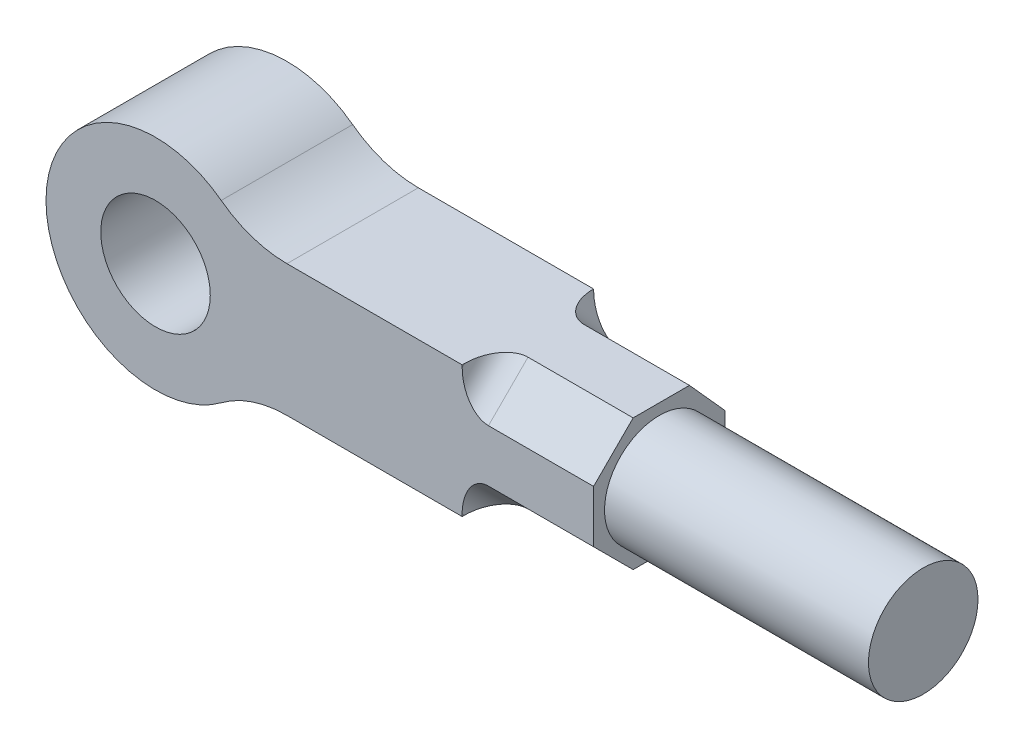
ISO-10303-21;
HEADER;
FILE_DESCRIPTION(('STEP AP214'),'2;1');
FILE_NAME('part.step','',(''),(''),'','','');
FILE_SCHEMA(('AUTOMOTIVE_DESIGN { 1 0 10303 214 1 1 1 1 }'));
ENDSEC;
DATA;
#1=APPLICATION_CONTEXT('core data for automotive mechanical design processes');
#2=APPLICATION_PROTOCOL_DEFINITION('international standard','automotive_design',2000,#1);
#3=PRODUCT_CONTEXT('',#1,'mechanical');
#4=PRODUCT('Part','Part','',(#3));
#5=PRODUCT_RELATED_PRODUCT_CATEGORY('part','',(#4));
#6=PRODUCT_DEFINITION_FORMATION('','',#4);
#7=PRODUCT_DEFINITION_CONTEXT('part definition',#1,'design');
#8=PRODUCT_DEFINITION('design','',#6,#7);
#9=PRODUCT_DEFINITION_SHAPE('','',#8);
#10=(LENGTH_UNIT() NAMED_UNIT(*) SI_UNIT(.MILLI.,.METRE.));
#11=(NAMED_UNIT(*) PLANE_ANGLE_UNIT() SI_UNIT($,.RADIAN.));
#12=(NAMED_UNIT(*) SI_UNIT($,.STERADIAN.) SOLID_ANGLE_UNIT());
#13=UNCERTAINTY_MEASURE_WITH_UNIT(LENGTH_MEASURE(1.E-05),#10,'distance_accuracy_value','');
#14=(GEOMETRIC_REPRESENTATION_CONTEXT(3) GLOBAL_UNCERTAINTY_ASSIGNED_CONTEXT((#13)) GLOBAL_UNIT_ASSIGNED_CONTEXT((#10,
#11,#12)) REPRESENTATION_CONTEXT('',''));
#15=CARTESIAN_POINT('',(0.,0.,0.));
#16=DIRECTION('',(0.,0.,1.));
#17=DIRECTION('',(1.,0.,0.));
#18=AXIS2_PLACEMENT_3D('',#15,#16,#17);
#19=CARTESIAN_POINT('',(60.,-80.,60.));
#20=DIRECTION('',(0.,0.,1.));
#21=DIRECTION('',(1.,0.,0.));
#22=AXIS2_PLACEMENT_3D('',#19,#20,#21);
#23=PLANE('',#22);
#24=CARTESIAN_POINT('',(0.,0.,60.));
#25=DIRECTION('',(0.,0.,1.));
#26=DIRECTION('',(1.,0.,0.));
#27=AXIS2_PLACEMENT_3D('',#24,#25,#26);
#28=CIRCLE('',#27,25.);
#29=CARTESIAN_POINT('',(25.,0.,60.));
#30=VERTEX_POINT('',#29);
#31=EDGE_CURVE('E318',#30,#30,#28,.T.);
#32=ORIENTED_EDGE('',*,*,#31,.F.);
#33=EDGE_LOOP('',(#32));
#34=FACE_BOUND('',#33,.T.);
#35=DIRECTION('',(0.,-1.,0.));
#36=VECTOR('',#35,1.);
#37=CARTESIAN_POINT('',(140.,0.,60.));
#38=LINE('',#37,#36);
#39=CARTESIAN_POINT('',(140.,-28.9105627484771,60.));
#40=VERTEX_POINT('',#39);
#41=CARTESIAN_POINT('',(140.,-30.,60.));
#42=VERTEX_POINT('',#41);
#43=EDGE_CURVE('E266',#40,#42,#38,.T.);
#44=ORIENTED_EDGE('',*,*,#43,.F.);
#45=CARTESIAN_POINT('',(152.,-28.9105627484771,60.));
#46=DIRECTION('',(0.,0.,1.));
#47=DIRECTION('',(0.,1.,0.));
#48=AXIS2_PLACEMENT_3D('',#45,#46,#47);
#49=ELLIPSE('',#48,16.9705627484771,12.);
#50=CARTESIAN_POINT('',(152.,-11.94,60.));
#51=VERTEX_POINT('',#50);
#52=EDGE_CURVE('E256',#40,#51,#49,.F.);
#53=ORIENTED_EDGE('',*,*,#52,.T.);
#54=DIRECTION('',(1.,0.,0.));
#55=VECTOR('',#54,1.);
#56=CARTESIAN_POINT('',(140.,-11.94,60.));
#57=LINE('',#56,#55);
#58=CARTESIAN_POINT('',(200.,-11.94,60.));
#59=VERTEX_POINT('',#58);
#60=EDGE_CURVE('E263',#51,#59,#57,.T.);
#61=ORIENTED_EDGE('',*,*,#60,.T.);
#62=DIRECTION('',(0.,1.,0.));
#63=VECTOR('',#62,1.);
#64=CARTESIAN_POINT('',(200.,30.,60.));
#65=LINE('',#64,#63);
#66=CARTESIAN_POINT('',(200.,11.94,60.));
#67=VERTEX_POINT('',#66);
#68=EDGE_CURVE('E325',#59,#67,#65,.T.);
#69=ORIENTED_EDGE('',*,*,#68,.T.);
#70=DIRECTION('',(1.,0.,0.));
#71=VECTOR('',#70,1.);
#72=CARTESIAN_POINT('',(140.,11.94,60.));
#73=LINE('',#72,#71);
#74=CARTESIAN_POINT('',(152.,11.94,60.));
#75=VERTEX_POINT('',#74);
#76=EDGE_CURVE('E308',#75,#67,#73,.T.);
#77=ORIENTED_EDGE('',*,*,#76,.F.);
#78=CARTESIAN_POINT('',(152.,28.9105627484771,60.));
#79=DIRECTION('',(0.,0.,1.));
#80=DIRECTION('',(0.,1.,0.));
#81=AXIS2_PLACEMENT_3D('',#78,#79,#80);
#82=ELLIPSE('',#81,16.9705627484771,12.);
#83=CARTESIAN_POINT('',(140.,28.9105627484771,60.));
#84=VERTEX_POINT('',#83);
#85=EDGE_CURVE('E54',#75,#84,#82,.F.);
#86=ORIENTED_EDGE('',*,*,#85,.T.);
#87=DIRECTION('',(0.,-1.,0.));
#88=VECTOR('',#87,1.);
#89=CARTESIAN_POINT('',(140.,0.,60.));
#90=LINE('',#89,#88);
#91=CARTESIAN_POINT('',(140.,30.,60.));
#92=VERTEX_POINT('',#91);
#93=EDGE_CURVE('E302',#92,#84,#90,.T.);
#94=ORIENTED_EDGE('',*,*,#93,.F.);
#95=DIRECTION('',(-1.,0.,0.));
#96=VECTOR('',#95,1.);
#97=CARTESIAN_POINT('',(60.,30.,60.));
#98=LINE('',#97,#96);
#99=CARTESIAN_POINT('',(60.,30.,60.));
#100=VERTEX_POINT('',#99);
#101=EDGE_CURVE('E328',#92,#100,#98,.T.);
#102=ORIENTED_EDGE('',*,*,#101,.T.);
#103=CARTESIAN_POINT('',(60.,80.,60.));
#104=DIRECTION('',(0.,0.,-1.));
#105=DIRECTION('',(-1.,0.,0.));
#106=AXIS2_PLACEMENT_3D('',#103,#104,#105);
#107=CIRCLE('',#106,50.);
#108=CARTESIAN_POINT('',(30.,40.,60.));
#109=VERTEX_POINT('',#108);
#110=EDGE_CURVE('E332',#100,#109,#107,.T.);
#111=ORIENTED_EDGE('',*,*,#110,.T.);
#112=CARTESIAN_POINT('',(0.,0.,60.));
#113=DIRECTION('',(0.,0.,1.));
#114=DIRECTION('',(1.,0.,0.));
#115=AXIS2_PLACEMENT_3D('',#112,#113,#114);
#116=CIRCLE('',#115,50.);
#117=CARTESIAN_POINT('',(30.,-40.,60.));
#118=VERTEX_POINT('',#117);
#119=EDGE_CURVE('E335',#109,#118,#116,.T.);
#120=ORIENTED_EDGE('',*,*,#119,.T.);
#121=CARTESIAN_POINT('',(60.,-80.,60.));
#122=DIRECTION('',(0.,0.,-1.));
#123=DIRECTION('',(1.,0.,0.));
#124=AXIS2_PLACEMENT_3D('',#121,#122,#123);
#125=CIRCLE('',#124,50.);
#126=CARTESIAN_POINT('',(60.,-30.,60.));
#127=VERTEX_POINT('',#126);
#128=EDGE_CURVE('E338',#118,#127,#125,.T.);
#129=ORIENTED_EDGE('',*,*,#128,.T.);
#130=DIRECTION('',(1.,0.,0.));
#131=VECTOR('',#130,1.);
#132=CARTESIAN_POINT('',(200.,-30.,60.));
#133=LINE('',#132,#131);
#134=EDGE_CURVE('E341',#127,#42,#133,.T.);
#135=ORIENTED_EDGE('',*,*,#134,.T.);
#136=EDGE_LOOP('',(#44,#53,#61,#69,#77,#86,#94,#102,#111,#120,#129,#135));
#137=FACE_BOUND('',#136,.T.);
#138=ADVANCED_FACE('F45',(#34,#137),#23,.T.);
#139=CARTESIAN_POINT('',(200.,30.,60.));
#140=DIRECTION('',(-1.,0.,0.));
#141=DIRECTION('',(0.,0.,1.));
#142=AXIS2_PLACEMENT_3D('',#139,#140,#141);
#143=PLANE('',#142);
#144=CARTESIAN_POINT('',(200.,0.,30.));
#145=DIRECTION('',(1.,0.,0.));
#146=DIRECTION('',(0.,0.,-1.));
#147=AXIS2_PLACEMENT_3D('',#144,#145,#146);
#148=CIRCLE('',#147,25.);
#149=CARTESIAN_POINT('',(200.,0.,4.99999999999999));
#150=VERTEX_POINT('',#149);
#151=EDGE_CURVE('E203',#150,#150,#148,.T.);
#152=ORIENTED_EDGE('',*,*,#151,.F.);
#153=EDGE_LOOP('',(#152));
#154=FACE_BOUND('',#153,.T.);
#155=DIRECTION('',(0.,-0.707106781186548,-0.707106781186547));
#156=VECTOR('',#155,1.);
#157=CARTESIAN_POINT('',(200.,-35.97,35.97));
#158=LINE('',#157,#156);
#159=CARTESIAN_POINT('',(200.,-30.,41.94));
#160=VERTEX_POINT('',#159);
#161=EDGE_CURVE('E273',#59,#160,#158,.T.);
#162=ORIENTED_EDGE('',*,*,#161,.T.);
#163=DIRECTION('',(0.,0.,-1.));
#164=VECTOR('',#163,1.);
#165=CARTESIAN_POINT('',(200.,-30.,60.));
#166=LINE('',#165,#164);
#167=CARTESIAN_POINT('',(200.,-30.,18.06));
#168=VERTEX_POINT('',#167);
#169=EDGE_CURVE('E344',#160,#168,#166,.T.);
#170=ORIENTED_EDGE('',*,*,#169,.T.);
#171=DIRECTION('',(0.,-0.707106781186548,0.707106781186547));
#172=VECTOR('',#171,1.);
#173=CARTESIAN_POINT('',(200.,-5.96999999999999,-5.97));
#174=LINE('',#173,#172);
#175=CARTESIAN_POINT('',(200.,-11.94,0.));
#176=VERTEX_POINT('',#175);
#177=EDGE_CURVE('E297',#176,#168,#174,.T.);
#178=ORIENTED_EDGE('',*,*,#177,.F.);
#179=DIRECTION('',(0.,1.,0.));
#180=VECTOR('',#179,1.);
#181=CARTESIAN_POINT('',(200.,30.,0.));
#182=LINE('',#181,#180);
#183=CARTESIAN_POINT('',(200.,11.94,0.));
#184=VERTEX_POINT('',#183);
#185=EDGE_CURVE('E193',#176,#184,#182,.T.);
#186=ORIENTED_EDGE('',*,*,#185,.T.);
#187=DIRECTION('',(0.,-0.743792235721476,-0.668410884172639));
#188=VECTOR('',#187,1.);
#189=CARTESIAN_POINT('',(200.,5.33447093436056,-5.93607638147687));
#190=LINE('',#189,#188);
#191=CARTESIAN_POINT('',(200.,30.,16.2296673565684));
#192=VERTEX_POINT('',#191);
#193=EDGE_CURVE('E174',#192,#184,#190,.T.);
#194=ORIENTED_EDGE('',*,*,#193,.F.);
#195=DIRECTION('',(0.,0.,-1.));
#196=VECTOR('',#195,1.);
#197=CARTESIAN_POINT('',(200.,30.,60.));
#198=LINE('',#197,#196);
#199=CARTESIAN_POINT('',(200.,30.,41.94));
#200=VERTEX_POINT('',#199);
#201=EDGE_CURVE('E190',#200,#192,#198,.T.);
#202=ORIENTED_EDGE('',*,*,#201,.F.);
#203=DIRECTION('',(0.,-0.707106781186548,0.707106781186548));
#204=VECTOR('',#203,1.);
#205=CARTESIAN_POINT('',(200.,35.97,35.97));
#206=LINE('',#205,#204);
#207=EDGE_CURVE('E303',#200,#67,#206,.T.);
#208=ORIENTED_EDGE('',*,*,#207,.T.);
#209=ORIENTED_EDGE('',*,*,#68,.F.);
#210=EDGE_LOOP('',(#162,#170,#178,#186,#194,#202,#208,#209));
#211=FACE_BOUND('',#210,.T.);
#212=ADVANCED_FACE('F188',(#154,#211),#143,.F.);
#213=CARTESIAN_POINT('',(60.,30.,60.));
#214=DIRECTION('',(0.,-1.,0.));
#215=DIRECTION('',(0.,0.,-1.));
#216=AXIS2_PLACEMENT_3D('',#213,#214,#215);
#217=PLANE('',#216);
#218=ORIENTED_EDGE('',*,*,#201,.T.);
#219=DIRECTION('',(1.,0.,0.));
#220=VECTOR('',#219,1.);
#221=CARTESIAN_POINT('',(140.,30.,16.2296673565684));
#222=LINE('',#221,#220);
#223=CARTESIAN_POINT('',(152.,30.,16.2296673565684));
#224=VERTEX_POINT('',#223);
#225=EDGE_CURVE('E170',#224,#192,#222,.T.);
#226=ORIENTED_EDGE('',*,*,#225,.F.);
#227=CARTESIAN_POINT('',(152.,30.,0.0961297587201877));
#228=DIRECTION('',(0.,-1.,0.));
#229=DIRECTION('',(0.,0.,-1.));
#230=AXIS2_PLACEMENT_3D('',#227,#228,#229);
#231=ELLIPSE('',#230,16.1335375978482,12.);
#232=CARTESIAN_POINT('',(140.,30.,0.0961297587201878));
#233=VERTEX_POINT('',#232);
#234=EDGE_CURVE('E250',#224,#233,#231,.T.);
#235=ORIENTED_EDGE('',*,*,#234,.T.);
#236=DIRECTION('',(0.,0.,1.));
#237=VECTOR('',#236,1.);
#238=CARTESIAN_POINT('',(140.,30.,0.));
#239=LINE('',#238,#237);
#240=CARTESIAN_POINT('',(140.,30.,0.));
#241=VERTEX_POINT('',#240);
#242=EDGE_CURVE('E195',#241,#233,#239,.T.);
#243=ORIENTED_EDGE('',*,*,#242,.F.);
#244=DIRECTION('',(-1.,0.,0.));
#245=VECTOR('',#244,1.);
#246=CARTESIAN_POINT('',(60.,30.,0.));
#247=LINE('',#246,#245);
#248=CARTESIAN_POINT('',(60.,30.,0.));
#249=VERTEX_POINT('',#248);
#250=EDGE_CURVE('E347',#241,#249,#247,.T.);
#251=ORIENTED_EDGE('',*,*,#250,.T.);
#252=DIRECTION('',(0.,0.,-1.));
#253=VECTOR('',#252,1.);
#254=CARTESIAN_POINT('',(60.,30.,60.));
#255=LINE('',#254,#253);
#256=EDGE_CURVE('E204',#100,#249,#255,.T.);
#257=ORIENTED_EDGE('',*,*,#256,.F.);
#258=ORIENTED_EDGE('',*,*,#101,.F.);
#259=DIRECTION('',(0.,0.,1.));
#260=VECTOR('',#259,1.);
#261=CARTESIAN_POINT('',(140.,30.,0.));
#262=LINE('',#261,#260);
#263=CARTESIAN_POINT('',(140.,30.,58.9105627484771));
#264=VERTEX_POINT('',#263);
#265=EDGE_CURVE('E299',#264,#92,#262,.T.);
#266=ORIENTED_EDGE('',*,*,#265,.F.);
#267=CARTESIAN_POINT('',(152.,30.,58.9105627484771));
#268=DIRECTION('',(0.,-1.,0.));
#269=DIRECTION('',(0.,0.,-1.));
#270=AXIS2_PLACEMENT_3D('',#267,#268,#269);
#271=ELLIPSE('',#270,16.9705627484771,12.);
#272=CARTESIAN_POINT('',(152.,30.,41.94));
#273=VERTEX_POINT('',#272);
#274=EDGE_CURVE('E11',#264,#273,#271,.T.);
#275=ORIENTED_EDGE('',*,*,#274,.T.);
#276=DIRECTION('',(1.,0.,0.));
#277=VECTOR('',#276,1.);
#278=CARTESIAN_POINT('',(140.,30.,41.94));
#279=LINE('',#278,#277);
#280=EDGE_CURVE('E200',#273,#200,#279,.T.);
#281=ORIENTED_EDGE('',*,*,#280,.T.);
#282=EDGE_LOOP('',(#218,#226,#235,#243,#251,#257,#258,#266,#275,#281));
#283=FACE_BOUND('',#282,.T.);
#284=ADVANCED_FACE('F198',(#283),#217,.F.);
#285=CARTESIAN_POINT('',(200.,-30.,60.));
#286=DIRECTION('',(0.,1.,0.));
#287=DIRECTION('',(-1.,0.,0.));
#288=AXIS2_PLACEMENT_3D('',#285,#286,#287);
#289=PLANE('',#288);
#290=DIRECTION('',(1.,0.,0.));
#291=VECTOR('',#290,1.);
#292=CARTESIAN_POINT('',(140.,-30.,41.94));
#293=LINE('',#292,#291);
#294=CARTESIAN_POINT('',(152.,-30.,41.94));
#295=VERTEX_POINT('',#294);
#296=EDGE_CURVE('E276',#295,#160,#293,.T.);
#297=ORIENTED_EDGE('',*,*,#296,.F.);
#298=CARTESIAN_POINT('',(152.,-30.,58.9105627484771));
#299=DIRECTION('',(0.,1.,0.));
#300=DIRECTION('',(0.,0.,1.));
#301=AXIS2_PLACEMENT_3D('',#298,#299,#300);
#302=ELLIPSE('',#301,16.9705627484771,12.);
#303=CARTESIAN_POINT('',(140.,-30.,58.9105627484771));
#304=VERTEX_POINT('',#303);
#305=EDGE_CURVE('E253',#295,#304,#302,.T.);
#306=ORIENTED_EDGE('',*,*,#305,.T.);
#307=DIRECTION('',(0.,0.,-1.));
#308=VECTOR('',#307,1.);
#309=CARTESIAN_POINT('',(140.,-30.,0.));
#310=LINE('',#309,#308);
#311=EDGE_CURVE('E277',#42,#304,#310,.T.);
#312=ORIENTED_EDGE('',*,*,#311,.F.);
#313=ORIENTED_EDGE('',*,*,#134,.F.);
#314=DIRECTION('',(0.,0.,-1.));
#315=VECTOR('',#314,1.);
#316=CARTESIAN_POINT('',(60.,-30.,60.));
#317=LINE('',#316,#315);
#318=CARTESIAN_POINT('',(60.,-30.,0.));
#319=VERTEX_POINT('',#318);
#320=EDGE_CURVE('E365',#127,#319,#317,.T.);
#321=ORIENTED_EDGE('',*,*,#320,.T.);
#322=DIRECTION('',(1.,0.,0.));
#323=VECTOR('',#322,1.);
#324=CARTESIAN_POINT('',(200.,-30.,0.));
#325=LINE('',#324,#323);
#326=CARTESIAN_POINT('',(140.,-30.,0.));
#327=VERTEX_POINT('',#326);
#328=EDGE_CURVE('E329',#319,#327,#325,.T.);
#329=ORIENTED_EDGE('',*,*,#328,.T.);
#330=DIRECTION('',(0.,0.,-1.));
#331=VECTOR('',#330,1.);
#332=CARTESIAN_POINT('',(140.,-30.,0.));
#333=LINE('',#332,#331);
#334=CARTESIAN_POINT('',(140.,-30.,1.08943725152286));
#335=VERTEX_POINT('',#334);
#336=EDGE_CURVE('E413',#335,#327,#333,.T.);
#337=ORIENTED_EDGE('',*,*,#336,.F.);
#338=CARTESIAN_POINT('',(152.,-30.,1.08943725152286));
#339=DIRECTION('',(0.,1.,0.));
#340=DIRECTION('',(0.,0.,1.));
#341=AXIS2_PLACEMENT_3D('',#338,#339,#340);
#342=ELLIPSE('',#341,16.9705627484771,12.);
#343=CARTESIAN_POINT('',(152.,-30.,18.06));
#344=VERTEX_POINT('',#343);
#345=EDGE_CURVE('E241',#335,#344,#342,.T.);
#346=ORIENTED_EDGE('',*,*,#345,.T.);
#347=DIRECTION('',(1.,0.,0.));
#348=VECTOR('',#347,1.);
#349=CARTESIAN_POINT('',(140.,-30.,18.06));
#350=LINE('',#349,#348);
#351=EDGE_CURVE('E196',#344,#168,#350,.T.);
#352=ORIENTED_EDGE('',*,*,#351,.T.);
#353=ORIENTED_EDGE('',*,*,#169,.F.);
#354=EDGE_LOOP('',(#297,#306,#312,#313,#321,#329,#337,#346,#352,#353));
#355=FACE_BOUND('',#354,.T.);
#356=ADVANCED_FACE('F283',(#355),#289,.F.);
#357=CARTESIAN_POINT('',(60.,-80.,0.));
#358=DIRECTION('',(0.,0.,1.));
#359=DIRECTION('',(1.,0.,0.));
#360=AXIS2_PLACEMENT_3D('',#357,#358,#359);
#361=PLANE('',#360);
#362=ORIENTED_EDGE('',*,*,#185,.F.);
#363=DIRECTION('',(1.,0.,0.));
#364=VECTOR('',#363,1.);
#365=CARTESIAN_POINT('',(140.,-11.94,0.));
#366=LINE('',#365,#364);
#367=CARTESIAN_POINT('',(152.,-11.94,0.));
#368=VERTEX_POINT('',#367);
#369=EDGE_CURVE('E416',#368,#176,#366,.T.);
#370=ORIENTED_EDGE('',*,*,#369,.F.);
#371=CARTESIAN_POINT('',(152.,-28.9105627484771,0.));
#372=DIRECTION('',(0.,0.,1.));
#373=DIRECTION('',(0.,-1.,0.));
#374=AXIS2_PLACEMENT_3D('',#371,#372,#373);
#375=ELLIPSE('',#374,16.9705627484771,12.);
#376=CARTESIAN_POINT('',(140.,-28.9105627484771,0.));
#377=VERTEX_POINT('',#376);
#378=EDGE_CURVE('E244',#368,#377,#375,.T.);
#379=ORIENTED_EDGE('',*,*,#378,.T.);
#380=DIRECTION('',(0.,1.,0.));
#381=VECTOR('',#380,1.);
#382=CARTESIAN_POINT('',(140.,0.,0.));
#383=LINE('',#382,#381);
#384=EDGE_CURVE('E409',#327,#377,#383,.T.);
#385=ORIENTED_EDGE('',*,*,#384,.F.);
#386=ORIENTED_EDGE('',*,*,#328,.F.);
#387=CARTESIAN_POINT('',(60.,-80.,0.));
#388=DIRECTION('',(0.,0.,-1.));
#389=DIRECTION('',(1.,0.,0.));
#390=AXIS2_PLACEMENT_3D('',#387,#388,#389);
#391=CIRCLE('',#390,50.);
#392=CARTESIAN_POINT('',(30.,-40.,0.));
#393=VERTEX_POINT('',#392);
#394=EDGE_CURVE('E356',#393,#319,#391,.T.);
#395=ORIENTED_EDGE('',*,*,#394,.F.);
#396=CARTESIAN_POINT('',(0.,0.,0.));
#397=DIRECTION('',(0.,0.,1.));
#398=DIRECTION('',(1.,0.,0.));
#399=AXIS2_PLACEMENT_3D('',#396,#397,#398);
#400=CIRCLE('',#399,50.);
#401=CARTESIAN_POINT('',(30.,40.,0.));
#402=VERTEX_POINT('',#401);
#403=EDGE_CURVE('E353',#402,#393,#400,.T.);
#404=ORIENTED_EDGE('',*,*,#403,.F.);
#405=CARTESIAN_POINT('',(60.,80.,0.));
#406=DIRECTION('',(0.,0.,-1.));
#407=DIRECTION('',(-1.,0.,0.));
#408=AXIS2_PLACEMENT_3D('',#405,#406,#407);
#409=CIRCLE('',#408,50.);
#410=EDGE_CURVE('E350',#249,#402,#409,.T.);
#411=ORIENTED_EDGE('',*,*,#410,.F.);
#412=ORIENTED_EDGE('',*,*,#250,.F.);
#413=DIRECTION('',(0.,1.,0.));
#414=VECTOR('',#413,1.);
#415=CARTESIAN_POINT('',(140.,0.,0.));
#416=LINE('',#415,#414);
#417=CARTESIAN_POINT('',(140.,29.8930290187504,0.));
#418=VERTEX_POINT('',#417);
#419=EDGE_CURVE('E183',#418,#241,#416,.T.);
#420=ORIENTED_EDGE('',*,*,#419,.F.);
#421=CARTESIAN_POINT('',(152.,29.8930290187504,0.));
#422=DIRECTION('',(0.,0.,1.));
#423=DIRECTION('',(0.,-1.,0.));
#424=AXIS2_PLACEMENT_3D('',#421,#422,#423);
#425=ELLIPSE('',#424,17.9530290187504,12.);
#426=CARTESIAN_POINT('',(152.,11.94,0.));
#427=VERTEX_POINT('',#426);
#428=EDGE_CURVE('E247',#418,#427,#425,.T.);
#429=ORIENTED_EDGE('',*,*,#428,.T.);
#430=DIRECTION('',(1.,0.,0.));
#431=VECTOR('',#430,1.);
#432=CARTESIAN_POINT('',(140.,11.94,0.));
#433=LINE('',#432,#431);
#434=EDGE_CURVE('E182',#427,#184,#433,.T.);
#435=ORIENTED_EDGE('',*,*,#434,.T.);
#436=EDGE_LOOP('',(#362,#370,#379,#385,#386,#395,#404,#411,#412,#420,#429,#435));
#437=FACE_BOUND('',#436,.T.);
#438=CARTESIAN_POINT('',(0.,0.,0.));
#439=DIRECTION('',(0.,0.,1.));
#440=DIRECTION('',(1.,0.,0.));
#441=AXIS2_PLACEMENT_3D('',#438,#439,#440);
#442=CIRCLE('',#441,25.);
#443=CARTESIAN_POINT('',(25.,0.,0.));
#444=VERTEX_POINT('',#443);
#445=EDGE_CURVE('E316',#444,#444,#442,.T.);
#446=ORIENTED_EDGE('',*,*,#445,.T.);
#447=EDGE_LOOP('',(#446));
#448=FACE_BOUND('',#447,.T.);
#449=ADVANCED_FACE('F385',(#437,#448),#361,.F.);
#450=CARTESIAN_POINT('',(60.,80.,60.));
#451=DIRECTION('',(0.,0.,-1.));
#452=DIRECTION('',(-1.,0.,0.));
#453=AXIS2_PLACEMENT_3D('',#450,#451,#452);
#454=CYLINDRICAL_SURFACE('',#453,50.);
#455=ORIENTED_EDGE('',*,*,#410,.T.);
#456=DIRECTION('',(0.,0.,-1.));
#457=VECTOR('',#456,1.);
#458=CARTESIAN_POINT('',(30.,40.,60.));
#459=LINE('',#458,#457);
#460=EDGE_CURVE('E212',#109,#402,#459,.T.);
#461=ORIENTED_EDGE('',*,*,#460,.F.);
#462=ORIENTED_EDGE('',*,*,#110,.F.);
#463=ORIENTED_EDGE('',*,*,#256,.T.);
#464=EDGE_LOOP('',(#455,#461,#462,#463));
#465=FACE_BOUND('',#464,.T.);
#466=ADVANCED_FACE('F397',(#465),#454,.F.);
#467=CARTESIAN_POINT('',(0.,0.,60.));
#468=DIRECTION('',(0.,0.,-1.));
#469=DIRECTION('',(-1.,0.,0.));
#470=AXIS2_PLACEMENT_3D('',#467,#468,#469);
#471=CYLINDRICAL_SURFACE('',#470,50.);
#472=ORIENTED_EDGE('',*,*,#403,.T.);
#473=DIRECTION('',(0.,0.,-1.));
#474=VECTOR('',#473,1.);
#475=CARTESIAN_POINT('',(30.,-40.,60.));
#476=LINE('',#475,#474);
#477=EDGE_CURVE('E369',#118,#393,#476,.T.);
#478=ORIENTED_EDGE('',*,*,#477,.F.);
#479=ORIENTED_EDGE('',*,*,#119,.F.);
#480=ORIENTED_EDGE('',*,*,#460,.T.);
#481=EDGE_LOOP('',(#472,#478,#479,#480));
#482=FACE_BOUND('',#481,.T.);
#483=ADVANCED_FACE('F378',(#482),#471,.T.);
#484=CARTESIAN_POINT('',(60.,-80.,60.));
#485=DIRECTION('',(0.,0.,-1.));
#486=DIRECTION('',(-1.,0.,0.));
#487=AXIS2_PLACEMENT_3D('',#484,#485,#486);
#488=CYLINDRICAL_SURFACE('',#487,50.);
#489=ORIENTED_EDGE('',*,*,#394,.T.);
#490=ORIENTED_EDGE('',*,*,#320,.F.);
#491=ORIENTED_EDGE('',*,*,#128,.F.);
#492=ORIENTED_EDGE('',*,*,#477,.T.);
#493=EDGE_LOOP('',(#489,#490,#491,#492));
#494=FACE_BOUND('',#493,.T.);
#495=ADVANCED_FACE('F392',(#494),#488,.F.);
#496=CARTESIAN_POINT('',(0.,0.,60.));
#497=DIRECTION('',(0.,0.,-1.));
#498=DIRECTION('',(-1.,0.,0.));
#499=AXIS2_PLACEMENT_3D('',#496,#497,#498);
#500=CYLINDRICAL_SURFACE('',#499,25.);
#501=ORIENTED_EDGE('',*,*,#31,.T.);
#502=EDGE_LOOP('',(#501));
#503=FACE_BOUND('',#502,.T.);
#504=ORIENTED_EDGE('',*,*,#445,.F.);
#505=EDGE_LOOP('',(#504));
#506=FACE_BOUND('',#505,.T.);
#507=ADVANCED_FACE('F455',(#503,#506),#500,.F.);
#508=CARTESIAN_POINT('',(320.5,0.,30.));
#509=DIRECTION('',(-1.,0.,0.));
#510=DIRECTION('',(0.,0.,1.));
#511=AXIS2_PLACEMENT_3D('',#508,#509,#510);
#512=CYLINDRICAL_SURFACE('',#511,25.);
#513=CARTESIAN_POINT('',(320.5,0.,30.));
#514=DIRECTION('',(1.,0.,0.));
#515=DIRECTION('',(0.,0.,-1.));
#516=AXIS2_PLACEMENT_3D('',#513,#514,#515);
#517=CIRCLE('',#516,25.);
#518=CARTESIAN_POINT('',(320.5,0.,4.99999999999999));
#519=VERTEX_POINT('',#518);
#520=EDGE_CURVE('E311',#519,#519,#517,.T.);
#521=ORIENTED_EDGE('',*,*,#520,.F.);
#522=EDGE_LOOP('',(#521));
#523=FACE_BOUND('',#522,.T.);
#524=ORIENTED_EDGE('',*,*,#151,.T.);
#525=EDGE_LOOP('',(#524));
#526=FACE_BOUND('',#525,.T.);
#527=ADVANCED_FACE('F500',(#523,#526),#512,.T.);
#528=CARTESIAN_POINT('',(320.5,0.,30.));
#529=DIRECTION('',(1.,0.,0.));
#530=DIRECTION('',(0.,0.,-1.));
#531=AXIS2_PLACEMENT_3D('',#528,#529,#530);
#532=PLANE('',#531);
#533=ORIENTED_EDGE('',*,*,#520,.T.);
#534=EDGE_LOOP('',(#533));
#535=FACE_BOUND('',#534,.T.);
#536=ADVANCED_FACE('F490',(#535),#532,.T.);
#537=CARTESIAN_POINT('',(140.,-5.96999999999999,-5.97));
#538=DIRECTION('',(0.,0.707106781186547,0.707106781186548));
#539=DIRECTION('',(0.,-0.707106781186548,0.707106781186547));
#540=AXIS2_PLACEMENT_3D('',#537,#538,#539);
#541=PLANE('',#540);
#542=ORIENTED_EDGE('',*,*,#351,.F.);
#543=DIRECTION('',(0.,-0.707106781186548,0.707106781186547));
#544=VECTOR('',#543,1.);
#545=CARTESIAN_POINT('',(152.,-5.96999999999999,-5.97));
#546=LINE('',#545,#544);
#547=EDGE_CURVE('E219',#344,#368,#546,.F.);
#548=ORIENTED_EDGE('',*,*,#547,.T.);
#549=ORIENTED_EDGE('',*,*,#369,.T.);
#550=ORIENTED_EDGE('',*,*,#177,.T.);
#551=EDGE_LOOP('',(#542,#548,#549,#550));
#552=FACE_BOUND('',#551,.T.);
#553=ADVANCED_FACE('F425',(#552),#541,.F.);
#554=CARTESIAN_POINT('',(140.,0.,0.));
#555=DIRECTION('',(1.,0.,0.));
#556=DIRECTION('',(0.,0.,-1.));
#557=AXIS2_PLACEMENT_3D('',#554,#555,#556);
#558=PLANE('',#557);
#559=ORIENTED_EDGE('',*,*,#384,.T.);
#560=DIRECTION('',(0.,-0.707106781186548,0.707106781186547));
#561=VECTOR('',#560,1.);
#562=CARTESIAN_POINT('',(140.,-14.4552813742386,-14.4552813742386));
#563=LINE('',#562,#561);
#564=EDGE_CURVE('E209',#377,#335,#563,.T.);
#565=ORIENTED_EDGE('',*,*,#564,.T.);
#566=ORIENTED_EDGE('',*,*,#336,.T.);
#567=EDGE_LOOP('',(#559,#565,#566));
#568=FACE_BOUND('',#567,.T.);
#569=ADVANCED_FACE('F482',(#568),#558,.T.);
#570=CARTESIAN_POINT('',(140.,-35.97,35.97));
#571=DIRECTION('',(0.,-0.707106781186547,0.707106781186548));
#572=DIRECTION('',(0.,-0.707106781186548,-0.707106781186547));
#573=AXIS2_PLACEMENT_3D('',#570,#571,#572);
#574=PLANE('',#573);
#575=ORIENTED_EDGE('',*,*,#60,.F.);
#576=DIRECTION('',(0.,-0.707106781186548,-0.707106781186547));
#577=VECTOR('',#576,1.);
#578=CARTESIAN_POINT('',(152.,-30.,41.94));
#579=LINE('',#578,#577);
#580=EDGE_CURVE('E228',#51,#295,#579,.T.);
#581=ORIENTED_EDGE('',*,*,#580,.T.);
#582=ORIENTED_EDGE('',*,*,#296,.T.);
#583=ORIENTED_EDGE('',*,*,#161,.F.);
#584=EDGE_LOOP('',(#575,#581,#582,#583));
#585=FACE_BOUND('',#584,.T.);
#586=ADVANCED_FACE('F271',(#585),#574,.T.);
#587=CARTESIAN_POINT('',(140.,0.,0.));
#588=DIRECTION('',(1.,0.,0.));
#589=DIRECTION('',(0.,0.,-1.));
#590=AXIS2_PLACEMENT_3D('',#587,#588,#589);
#591=PLANE('',#590);
#592=ORIENTED_EDGE('',*,*,#311,.T.);
#593=DIRECTION('',(0.,-0.707106781186548,-0.707106781186547));
#594=VECTOR('',#593,1.);
#595=CARTESIAN_POINT('',(140.,-20.4252813742385,68.4852813742386));
#596=LINE('',#595,#594);
#597=EDGE_CURVE('E232',#304,#40,#596,.F.);
#598=ORIENTED_EDGE('',*,*,#597,.T.);
#599=ORIENTED_EDGE('',*,*,#43,.T.);
#600=EDGE_LOOP('',(#592,#598,#599));
#601=FACE_BOUND('',#600,.T.);
#602=ADVANCED_FACE('F287',(#601),#591,.T.);
#603=CARTESIAN_POINT('',(140.,35.97,35.97));
#604=DIRECTION('',(0.,0.707106781186547,0.707106781186547));
#605=DIRECTION('',(0.,-0.707106781186548,0.707106781186548));
#606=AXIS2_PLACEMENT_3D('',#603,#604,#605);
#607=PLANE('',#606);
#608=ORIENTED_EDGE('',*,*,#280,.F.);
#609=DIRECTION('',(0.,-0.707106781186548,0.707106781186548));
#610=VECTOR('',#609,1.);
#611=CARTESIAN_POINT('',(152.,11.94,60.));
#612=LINE('',#611,#610);
#613=EDGE_CURVE('E235',#273,#75,#612,.T.);
#614=ORIENTED_EDGE('',*,*,#613,.T.);
#615=ORIENTED_EDGE('',*,*,#76,.T.);
#616=ORIENTED_EDGE('',*,*,#207,.F.);
#617=EDGE_LOOP('',(#608,#614,#615,#616));
#618=FACE_BOUND('',#617,.T.);
#619=ADVANCED_FACE('F479',(#618),#607,.T.);
#620=CARTESIAN_POINT('',(140.,0.,0.));
#621=DIRECTION('',(1.,0.,0.));
#622=DIRECTION('',(0.,0.,-1.));
#623=AXIS2_PLACEMENT_3D('',#620,#621,#622);
#624=PLANE('',#623);
#625=ORIENTED_EDGE('',*,*,#93,.T.);
#626=DIRECTION('',(0.,-0.707106781186548,0.707106781186548));
#627=VECTOR('',#626,1.);
#628=CARTESIAN_POINT('',(140.,38.4852813742386,50.4252813742386));
#629=LINE('',#628,#627);
#630=EDGE_CURVE('E67',#84,#264,#629,.F.);
#631=ORIENTED_EDGE('',*,*,#630,.T.);
#632=ORIENTED_EDGE('',*,*,#265,.T.);
#633=EDGE_LOOP('',(#625,#631,#632));
#634=FACE_BOUND('',#633,.T.);
#635=ADVANCED_FACE('F441',(#634),#624,.T.);
#636=CARTESIAN_POINT('',(140.,5.33447093436056,-5.93607638147687));
#637=DIRECTION('',(0.,-0.668410884172639,0.743792235721476));
#638=DIRECTION('',(0.,-0.743792235721476,-0.668410884172639));
#639=AXIS2_PLACEMENT_3D('',#636,#637,#638);
#640=PLANE('',#639);
#641=ORIENTED_EDGE('',*,*,#434,.F.);
#642=DIRECTION('',(0.,-0.743792235721476,-0.668410884172639));
#643=VECTOR('',#642,1.);
#644=CARTESIAN_POINT('',(152.,5.33447093436056,-5.93607638147687));
#645=LINE('',#644,#643);
#646=EDGE_CURVE('E177',#427,#224,#645,.F.);
#647=ORIENTED_EDGE('',*,*,#646,.T.);
#648=ORIENTED_EDGE('',*,*,#225,.T.);
#649=ORIENTED_EDGE('',*,*,#193,.T.);
#650=EDGE_LOOP('',(#641,#647,#648,#649));
#651=FACE_BOUND('',#650,.T.);
#652=ADVANCED_FACE('F173',(#651),#640,.F.);
#653=CARTESIAN_POINT('',(140.,0.,0.));
#654=DIRECTION('',(1.,0.,0.));
#655=DIRECTION('',(0.,0.,-1.));
#656=AXIS2_PLACEMENT_3D('',#653,#654,#655);
#657=PLANE('',#656);
#658=ORIENTED_EDGE('',*,*,#242,.T.);
#659=DIRECTION('',(0.,-0.743792235721476,-0.668410884172639));
#660=VECTOR('',#659,1.);
#661=CARTESIAN_POINT('',(140.,13.3554015444322,-14.8615832101346));
#662=LINE('',#661,#660);
#663=EDGE_CURVE('E222',#233,#418,#662,.T.);
#664=ORIENTED_EDGE('',*,*,#663,.T.);
#665=ORIENTED_EDGE('',*,*,#419,.T.);
#666=EDGE_LOOP('',(#658,#664,#665));
#667=FACE_BOUND('',#666,.T.);
#668=ADVANCED_FACE('F431',(#667),#657,.T.);
#669=CARTESIAN_POINT('',(152.,-14.4552813742386,-14.4552813742386));
#670=DIRECTION('',(0.,-0.707106781186548,0.707106781186547));
#671=DIRECTION('',(0.,-0.707106781186547,-0.707106781186548));
#672=AXIS2_PLACEMENT_3D('',#669,#670,#671);
#673=CYLINDRICAL_SURFACE('',#672,12.);
#674=ORIENTED_EDGE('',*,*,#378,.F.);
#675=ORIENTED_EDGE('',*,*,#547,.F.);
#676=ORIENTED_EDGE('',*,*,#345,.F.);
#677=ORIENTED_EDGE('',*,*,#564,.F.);
#678=EDGE_LOOP('',(#674,#675,#676,#677));
#679=FACE_BOUND('',#678,.T.);
#680=ADVANCED_FACE('F433',(#679),#673,.F.);
#681=CARTESIAN_POINT('',(152.,13.3554015444322,-14.8615832101346));
#682=DIRECTION('',(0.,-0.743792235721476,-0.668410884172639));
#683=DIRECTION('',(0.,0.668410884172639,-0.743792235721476));
#684=AXIS2_PLACEMENT_3D('',#681,#682,#683);
#685=CYLINDRICAL_SURFACE('',#684,12.);
#686=ORIENTED_EDGE('',*,*,#234,.F.);
#687=ORIENTED_EDGE('',*,*,#646,.F.);
#688=ORIENTED_EDGE('',*,*,#428,.F.);
#689=ORIENTED_EDGE('',*,*,#663,.F.);
#690=EDGE_LOOP('',(#686,#687,#688,#689));
#691=FACE_BOUND('',#690,.T.);
#692=ADVANCED_FACE('F429',(#691),#685,.F.);
#693=CARTESIAN_POINT('',(152.,-44.4552813742386,44.4552813742386));
#694=DIRECTION('',(0.,0.707106781186548,0.707106781186547));
#695=DIRECTION('',(0.,-0.707106781186547,0.707106781186548));
#696=AXIS2_PLACEMENT_3D('',#693,#694,#695);
#697=CYLINDRICAL_SURFACE('',#696,12.);
#698=ORIENTED_EDGE('',*,*,#52,.F.);
#699=ORIENTED_EDGE('',*,*,#597,.F.);
#700=ORIENTED_EDGE('',*,*,#305,.F.);
#701=ORIENTED_EDGE('',*,*,#580,.F.);
#702=EDGE_LOOP('',(#698,#699,#700,#701));
#703=FACE_BOUND('',#702,.T.);
#704=ADVANCED_FACE('F279',(#703),#697,.F.);
#705=CARTESIAN_POINT('',(152.,44.4552813742386,44.4552813742386));
#706=DIRECTION('',(0.,0.707106781186548,-0.707106781186548));
#707=DIRECTION('',(0.,0.707106781186548,0.707106781186548));
#708=AXIS2_PLACEMENT_3D('',#705,#706,#707);
#709=CYLINDRICAL_SURFACE('',#708,12.);
#710=ORIENTED_EDGE('',*,*,#274,.F.);
#711=ORIENTED_EDGE('',*,*,#630,.F.);
#712=ORIENTED_EDGE('',*,*,#85,.F.);
#713=ORIENTED_EDGE('',*,*,#613,.F.);
#714=EDGE_LOOP('',(#710,#711,#712,#713));
#715=FACE_BOUND('',#714,.T.);
#716=ADVANCED_FACE('F47',(#715),#709,.F.);
#717=CLOSED_SHELL('',(#138,#212,#284,#356,#449,#466,#483,#495,#507,#527,#536,#553,#569,#586,
#602,#619,#635,#652,#668,#680,#692,#704,#716));
#718=MANIFOLD_SOLID_BREP('B2',#717);
#719=ADVANCED_BREP_SHAPE_REPRESENTATION('',(#18,#718),#14);
#720=SHAPE_DEFINITION_REPRESENTATION(#9,#719);
ENDSEC;
END-ISO-10303-21;
